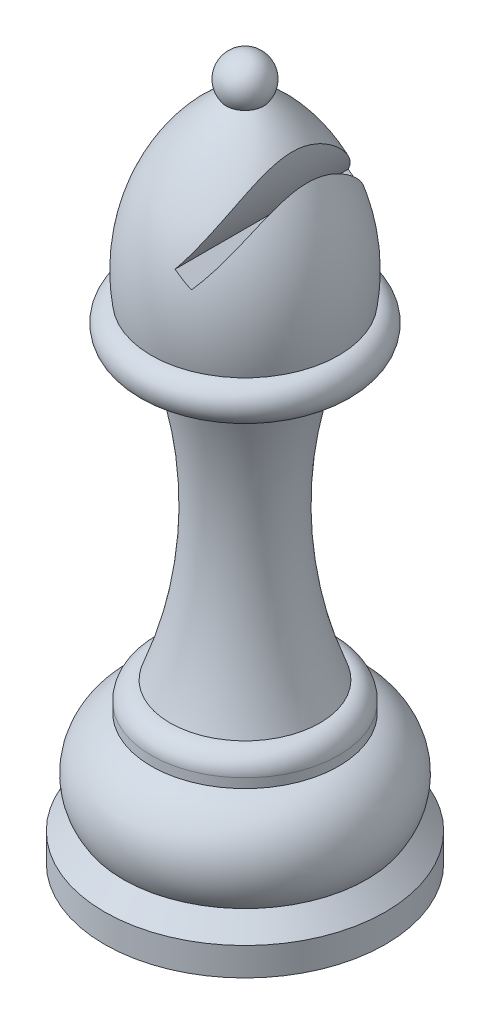
ISO-10303-21;
HEADER;
FILE_DESCRIPTION(('STEP AP214'),'2;1');
FILE_NAME('part.step','',(''),(''),'','','');
FILE_SCHEMA(('AUTOMOTIVE_DESIGN { 1 0 10303 214 1 1 1 1 }'));
ENDSEC;
DATA;
#1=APPLICATION_CONTEXT('core data for automotive mechanical design processes');
#2=APPLICATION_PROTOCOL_DEFINITION('international standard','automotive_design',2000,#1);
#3=PRODUCT_CONTEXT('',#1,'mechanical');
#4=PRODUCT('Part','Part','',(#3));
#5=PRODUCT_RELATED_PRODUCT_CATEGORY('part','',(#4));
#6=PRODUCT_DEFINITION_FORMATION('','',#4);
#7=PRODUCT_DEFINITION_CONTEXT('part definition',#1,'design');
#8=PRODUCT_DEFINITION('design','',#6,#7);
#9=PRODUCT_DEFINITION_SHAPE('','',#8);
#10=(LENGTH_UNIT() NAMED_UNIT(*) SI_UNIT(.MILLI.,.METRE.));
#11=(NAMED_UNIT(*) PLANE_ANGLE_UNIT() SI_UNIT($,.RADIAN.));
#12=(NAMED_UNIT(*) SI_UNIT($,.STERADIAN.) SOLID_ANGLE_UNIT());
#13=UNCERTAINTY_MEASURE_WITH_UNIT(LENGTH_MEASURE(1.E-05),#10,'distance_accuracy_value','');
#14=(GEOMETRIC_REPRESENTATION_CONTEXT(3) GLOBAL_UNCERTAINTY_ASSIGNED_CONTEXT((#13)) GLOBAL_UNIT_ASSIGNED_CONTEXT((#10,
#11,#12)) REPRESENTATION_CONTEXT('',''));
#15=CARTESIAN_POINT('',(0.,0.,0.));
#16=DIRECTION('',(0.,0.,1.));
#17=DIRECTION('',(1.,0.,0.));
#18=AXIS2_PLACEMENT_3D('',#15,#16,#17);
#19=CARTESIAN_POINT('',(0.,-57.54,0.));
#20=DIRECTION('',(0.,1.,0.));
#21=DIRECTION('',(0.,0.,1.));
#22=AXIS2_PLACEMENT_3D('',#19,#20,#21);
#23=TOROIDAL_SURFACE('',#22,7.99999999999999,2.);
#24=CARTESIAN_POINT('',(0.,-57.54,0.));
#25=DIRECTION('',(0.,1.,0.));
#26=DIRECTION('',(0.,0.,1.));
#27=AXIS2_PLACEMENT_3D('',#24,#25,#26);
#28=CIRCLE('',#27,9.99999999999999);
#29=CARTESIAN_POINT('',(0.,-57.54,9.99999999999999));
#30=VERTEX_POINT('',#29);
#31=EDGE_CURVE('E106',#30,#30,#28,.T.);
#32=ORIENTED_EDGE('',*,*,#31,.T.);
#33=EDGE_LOOP('',(#32));
#34=FACE_BOUND('',#33,.T.);
#35=CARTESIAN_POINT('',(0.,-55.54,0.));
#36=DIRECTION('',(0.,1.,0.));
#37=DIRECTION('',(0.,0.,1.));
#38=AXIS2_PLACEMENT_3D('',#35,#36,#37);
#39=CIRCLE('',#38,7.99999999999999);
#40=CARTESIAN_POINT('',(0.,-55.54,7.99999999999999));
#41=VERTEX_POINT('',#40);
#42=EDGE_CURVE('E74',#41,#41,#39,.T.);
#43=ORIENTED_EDGE('',*,*,#42,.F.);
#44=EDGE_LOOP('',(#43));
#45=FACE_BOUND('',#44,.T.);
#46=ADVANCED_FACE('F34',(#34,#45),#23,.T.);
#47=CARTESIAN_POINT('',(0.,9.94220309819706,0.));
#48=DIRECTION('',(0.,1.,0.));
#49=DIRECTION('',(0.,0.,1.));
#50=AXIS2_PLACEMENT_3D('',#47,#48,#49);
#51=CYLINDRICAL_SURFACE('',#50,9.99999999999999);
#52=CARTESIAN_POINT('',(0.,-58.54,0.));
#53=DIRECTION('',(0.,1.,0.));
#54=DIRECTION('',(0.,0.,1.));
#55=AXIS2_PLACEMENT_3D('',#52,#53,#54);
#56=CIRCLE('',#55,9.99999999999999);
#57=CARTESIAN_POINT('',(0.,-58.54,9.99999999999999));
#58=VERTEX_POINT('',#57);
#59=EDGE_CURVE('E103',#58,#58,#56,.T.);
#60=ORIENTED_EDGE('',*,*,#59,.T.);
#61=EDGE_LOOP('',(#60));
#62=FACE_BOUND('',#61,.T.);
#63=ORIENTED_EDGE('',*,*,#31,.F.);
#64=EDGE_LOOP('',(#63));
#65=FACE_BOUND('',#64,.T.);
#66=ADVANCED_FACE('F157',(#62,#65),#51,.T.);
#67=CARTESIAN_POINT('',(0.,-64.1961933857143,0.));
#68=DIRECTION('',(0.,1.,0.));
#69=DIRECTION('',(0.,0.,1.));
#70=AXIS2_PLACEMENT_3D('',#67,#68,#69);
#71=TOROIDAL_SURFACE('',#70,7.99813177671416,6.);
#72=CARTESIAN_POINT('',(0.,-67.51,0.));
#73=DIRECTION('',(0.,1.,0.));
#74=DIRECTION('',(0.,0.,1.));
#75=AXIS2_PLACEMENT_3D('',#72,#73,#74);
#76=CIRCLE('',#75,13.);
#77=CARTESIAN_POINT('',(0.,-67.51,13.));
#78=VERTEX_POINT('',#77);
#79=EDGE_CURVE('E100',#78,#78,#76,.T.);
#80=ORIENTED_EDGE('',*,*,#79,.T.);
#81=EDGE_LOOP('',(#80));
#82=FACE_BOUND('',#81,.T.);
#83=ORIENTED_EDGE('',*,*,#59,.F.);
#84=EDGE_LOOP('',(#83));
#85=FACE_BOUND('',#84,.T.);
#86=ADVANCED_FACE('F162',(#82,#85),#71,.T.);
#87=CARTESIAN_POINT('',(0.,-67.51,0.));
#88=DIRECTION('',(0.,-1.,0.));
#89=DIRECTION('',(0.,0.,-1.));
#90=AXIS2_PLACEMENT_3D('',#87,#88,#89);
#91=CONICAL_SURFACE('',#90,13.,0.785398163397453);
#92=CARTESIAN_POINT('',(0.,-69.51,0.));
#93=DIRECTION('',(0.,1.,0.));
#94=DIRECTION('',(0.,0.,1.));
#95=AXIS2_PLACEMENT_3D('',#92,#93,#94);
#96=CIRCLE('',#95,15.);
#97=CARTESIAN_POINT('',(0.,-69.51,15.));
#98=VERTEX_POINT('',#97);
#99=EDGE_CURVE('E92',#98,#98,#96,.T.);
#100=ORIENTED_EDGE('',*,*,#99,.T.);
#101=EDGE_LOOP('',(#100));
#102=FACE_BOUND('',#101,.T.);
#103=ORIENTED_EDGE('',*,*,#79,.F.);
#104=EDGE_LOOP('',(#103));
#105=FACE_BOUND('',#104,.T.);
#106=ADVANCED_FACE('F173',(#102,#105),#91,.T.);
#107=CARTESIAN_POINT('',(0.,9.94220309819706,0.));
#108=DIRECTION('',(0.,1.,0.));
#109=DIRECTION('',(0.,0.,1.));
#110=AXIS2_PLACEMENT_3D('',#107,#108,#109);
#111=CYLINDRICAL_SURFACE('',#110,15.);
#112=CARTESIAN_POINT('',(0.,-72.51,0.));
#113=DIRECTION('',(0.,1.,0.));
#114=DIRECTION('',(0.,0.,1.));
#115=AXIS2_PLACEMENT_3D('',#112,#113,#114);
#116=CIRCLE('',#115,15.);
#117=CARTESIAN_POINT('',(0.,-72.51,15.));
#118=VERTEX_POINT('',#117);
#119=EDGE_CURVE('E89',#118,#118,#116,.T.);
#120=ORIENTED_EDGE('',*,*,#119,.T.);
#121=EDGE_LOOP('',(#120));
#122=FACE_BOUND('',#121,.T.);
#123=ORIENTED_EDGE('',*,*,#99,.F.);
#124=EDGE_LOOP('',(#123));
#125=FACE_BOUND('',#124,.T.);
#126=ADVANCED_FACE('F179',(#122,#125),#111,.T.);
#127=CARTESIAN_POINT('',(-15.,-72.51,0.));
#128=DIRECTION('',(0.,-1.,0.));
#129=DIRECTION('',(0.,0.,-1.));
#130=AXIS2_PLACEMENT_3D('',#127,#128,#129);
#131=PLANE('',#130);
#132=ORIENTED_EDGE('',*,*,#119,.F.);
#133=EDGE_LOOP('',(#132));
#134=FACE_BOUND('',#133,.T.);
#135=ADVANCED_FACE('F183',(#134),#131,.T.);
#136=CARTESIAN_POINT('',(0.,0.,0.));
#137=DIRECTION('',(0.,1.,0.));
#138=DIRECTION('',(1.,0.,0.));
#139=AXIS2_PLACEMENT_3D('',#136,#137,#138);
#140=SPHERICAL_SURFACE('',#139,2.5);
#141=CARTESIAN_POINT('',(0.,-1.5,0.));
#142=DIRECTION('',(0.,1.,0.));
#143=DIRECTION('',(0.,0.,1.));
#144=AXIS2_PLACEMENT_3D('',#141,#142,#143);
#145=CIRCLE('',#144,2.);
#146=CARTESIAN_POINT('',(0.,-1.5,2.));
#147=VERTEX_POINT('',#146);
#148=EDGE_CURVE('E87',#147,#147,#145,.T.);
#149=ORIENTED_EDGE('',*,*,#148,.T.);
#150=EDGE_LOOP('',(#149));
#151=FACE_BOUND('',#150,.T.);
#152=ADVANCED_FACE('F80',(#151),#140,.T.);
#153=CARTESIAN_POINT('',(0.,-17.6567163069648,0.));
#154=DIRECTION('',(0.,1.,0.));
#155=DIRECTION('',(0.,0.,1.));
#156=AXIS2_PLACEMENT_3D('',#153,#154,#155);
#157=DEGENERATE_TOROIDAL_SURFACE('',#156,9.78815160134356,20.,.F.);
#158=CARTESIAN_POINT('',(3.39324244572902,-13.248729612367,-9.10852018608392));
#159=CARTESIAN_POINT('',(3.2595717966119,-13.1513035375879,-9.13482636648575));
#160=CARTESIAN_POINT('',(3.12542693965622,-13.0535318356374,-9.15742841355983));
#161=CARTESIAN_POINT('',(2.85672002664111,-12.8576843554764,-9.19519504568503));
#162=CARTESIAN_POINT('',(2.72215929474827,-12.7596095423868,-9.21037405208227));
#163=CARTESIAN_POINT('',(2.45262560632293,-12.5631594655938,-9.23336817218856));
#164=CARTESIAN_POINT('',(2.31765264166154,-12.4647841959657,-9.24118313973178));
#165=CARTESIAN_POINT('',(2.04729543465764,-12.267733896288,-9.24947444345053));
#166=CARTESIAN_POINT('',(1.91191090407078,-12.1690586561511,-9.24993640694499));
#167=CARTESIAN_POINT('',(1.77658429981895,-12.0704256357197,-9.24671953048214));
#168=B_SPLINE_CURVE_WITH_KNOTS('',3,(#158,#159,#160,#161,#162,#163,#164,#165,#166,#167),
.UNSPECIFIED.,.F.,.F.,(4,2,2,2,4),(0.,0.502414031168213,1.00384806515695,1.50529205169696,
2.00771607460314),.UNSPECIFIED.);
#169=CARTESIAN_POINT('',(3.39304244572901,-13.2485838420346,-9.10855954127141));
#170=VERTEX_POINT('',#169);
#171=CARTESIAN_POINT('',(1.77678429981895,-12.0705714060521,-9.24672428054398));
#172=VERTEX_POINT('',#171);
#173=EDGE_CURVE('E11',#170,#172,#168,.T.);
#174=ORIENTED_EDGE('',*,*,#173,.F.);
#175=CARTESIAN_POINT('',(3.39287762474508,-13.2487838420346,9.10866916223183));
#176=CARTESIAN_POINT('',(3.59065928543186,-13.0088528453584,8.97711955453691));
#177=CARTESIAN_POINT('',(3.77821557079788,-12.7664321154023,8.83506159507021));
#178=CARTESIAN_POINT('',(4.13309084565667,-12.2793995862603,8.53126278346262));
#179=CARTESIAN_POINT('',(4.30042284128863,-12.0347893050636,8.36953471679838));
#180=CARTESIAN_POINT('',(4.61583553214681,-11.5450452614372,8.02699402593315));
#181=CARTESIAN_POINT('',(4.76385112573451,-11.2999124219678,7.84612040514663));
#182=CARTESIAN_POINT('',(5.0406598808591,-10.81254584413,7.46656284991351));
#183=CARTESIAN_POINT('',(5.16944983637574,-10.5703125954712,7.26787595379106));
#184=CARTESIAN_POINT('',(5.41330190571806,-10.0821264437611,6.84509889902637));
#185=CARTESIAN_POINT('',(5.52762319377013,-9.83640303268625,6.62031627708898));
#186=CARTESIAN_POINT('',(5.73742180468711,-9.35453553032749,6.1523113082327));
#187=CARTESIAN_POINT('',(5.83289535978563,-9.11839336186774,5.90908528779958));
#188=CARTESIAN_POINT('',(6.00600711677011,-8.66017088752531,5.40443206642151));
#189=CARTESIAN_POINT('',(6.08367130929929,-8.43807043698877,5.14303212415213));
#190=CARTESIAN_POINT('',(6.2225388930289,-8.01275269376267,4.60126052951307));
#191=CARTESIAN_POINT('',(6.28375283169019,-7.80952335639987,4.32090117845341));
#192=CARTESIAN_POINT('',(6.36848576051102,-7.50869763585441,3.86241639708243));
#193=CARTESIAN_POINT('',(6.39704130959248,-7.40257169472129,3.69078072049819));
#194=CARTESIAN_POINT('',(6.4492976182802,-7.20062591601889,3.34077039440289));
#195=CARTESIAN_POINT('',(6.47299803963671,-7.10480679673173,3.16239527638936));
#196=CARTESIAN_POINT('',(6.51572898105162,-6.92560945338317,2.79932457436113));
#197=CARTESIAN_POINT('',(6.53476769472171,-6.8422095034886,2.61464073964285));
#198=CARTESIAN_POINT('',(6.56843503629945,-6.68988111318258,2.2390230613816));
#199=CARTESIAN_POINT('',(6.58306527209652,-6.62094739934054,2.0480915247777));
#200=CARTESIAN_POINT('',(6.6060185853435,-6.50993497884289,1.69293802801173));
#201=CARTESIAN_POINT('',(6.61498610671272,-6.46529622351715,1.52955902739174));
#202=CARTESIAN_POINT('',(6.630068075759,-6.38896801664939,1.1997283273432));
#203=CARTESIAN_POINT('',(6.63618392353707,-6.35727221139155,1.03327817759301));
#204=CARTESIAN_POINT('',(6.64562496656999,-6.307872655926,0.69835246569176));
#205=CARTESIAN_POINT('',(6.64895235309748,-6.29015791953277,0.529878599661379));
#206=CARTESIAN_POINT('',(6.65285854624023,-6.269325826847,0.19198944902191));
#207=CARTESIAN_POINT('',(6.65343734637262,-6.26620850498426,0.0225741621933085));
#208=CARTESIAN_POINT('',(6.65185166821324,-6.27469377614706,-0.315995635086534));
#209=CARTESIAN_POINT('',(6.6496851731339,-6.28630719088085,-0.48514986231406));
#210=CARTESIAN_POINT('',(6.64258330008858,-6.3238360941999,-0.821790243561001));
#211=CARTESIAN_POINT('',(6.63764790765,-6.34975165754031,-0.989276388856947));
#212=CARTESIAN_POINT('',(6.62495240875765,-6.41501578536894,-1.32164894466047));
#213=CARTESIAN_POINT('',(6.61718958462753,-6.4543772715669,-1.48653269417007));
#214=CARTESIAN_POINT('',(6.59876136812688,-6.54533998067559,-1.81279016712529));
#215=CARTESIAN_POINT('',(6.58809427179658,-6.59694838666272,-1.97416176975302));
#216=CARTESIAN_POINT('',(6.55867086505095,-6.73493271193583,-2.35941027467546));
#217=CARTESIAN_POINT('',(6.53839724279052,-6.82682238804541,-2.58120304062644));
#218=CARTESIAN_POINT('',(6.49149433356611,-7.02871220319607,-3.01558048397352));
#219=CARTESIAN_POINT('',(6.46486446222178,-7.13871400714002,-3.22816431259459));
#220=CARTESIAN_POINT('',(6.40478416860406,-7.37383811521088,-3.64458872137908));
#221=CARTESIAN_POINT('',(6.3713136201585,-7.49900458280458,-3.848401302605));
#222=CARTESIAN_POINT('',(6.29720889637722,-7.76137406348501,-4.24669199032426));
#223=CARTESIAN_POINT('',(6.25657480598565,-7.8985769338363,-4.44117020746823));
#224=CARTESIAN_POINT('',(6.14648820069791,-8.25064921889427,-4.91185544352306));
#225=CARTESIAN_POINT('',(6.07254351673479,-8.47130099334055,-5.18270615772814));
#226=CARTESIAN_POINT('',(5.90677777706816,-8.9280969096506,-5.70527345736642));
#227=CARTESIAN_POINT('',(5.81494846381267,-9.16424817429789,-5.95698112928992));
#228=CARTESIAN_POINT('',(5.61227848103953,-9.6472797537831,-6.44126344484155));
#229=CARTESIAN_POINT('',(5.50145429272416,-9.89415063008096,-6.67385441867144));
#230=CARTESIAN_POINT('',(5.25962960520234,-10.3950209361088,-7.11996328535031));
#231=CARTESIAN_POINT('',(5.12863508221723,-10.6490182361973,-7.3334867981423));
#232=CARTESIAN_POINT('',(4.87942778683282,-11.0995109334168,-7.69210680535139));
#233=CARTESIAN_POINT('',(4.7656744901184,-11.2951999198998,-7.84133918144583));
#234=CARTESIAN_POINT('',(4.52559764358338,-11.6874108438505,-8.12806138758332));
#235=CARTESIAN_POINT('',(4.39927695844201,-11.8839325817623,-8.26555388046172));
#236=CARTESIAN_POINT('',(4.13388603513372,-12.2763176527467,-8.52818873513225));
#237=CARTESIAN_POINT('',(3.99482694248693,-12.4721814088524,-8.653341698058));
#238=CARTESIAN_POINT('',(3.70366159518798,-12.8621607910959,-8.89081993765263));
#239=CARTESIAN_POINT('',(3.55154869076117,-13.0562754699283,-9.00313860763272));
#240=CARTESIAN_POINT('',(3.39287762474508,-13.2487838420346,-9.10866916223183));
#241=B_SPLINE_CURVE_WITH_KNOTS('',3,(#175,#176,#177,#178,#179,#180,#181,#182,#183,#184,#185,
#186,#187,#188,#189,#190,#191,#192,#193,#194,#195,#196,#197,#198,#199,#200,#201,#202,#203,#204,
#205,#206,#207,#208,#209,#210,#211,#212,#213,#214,#215,#216,#217,#218,#219,#220,#221,#222,#223,
#224,#225,#226,#227,#228,#229,#230,#231,#232,#233,#234,#235,#236,#237,#238,#239,#240),
.UNSPECIFIED.,.F.,.F.,(4,2,2,2,2,2,2,2,2,2,2,2,2,2,2,2,2,2,2,2,2,2,2,2,2,2,2,2,2,2,2,2,4),(0.,
1.01236238775747,2.02407022658224,3.03910427971063,4.05430740879688,5.10951041006697,
6.1649241391425,7.21878767361562,8.27197387813874,8.88303842014661,9.49414551967276,
10.1041706748076,10.7139730674466,11.222292135026,11.7303613670735,12.2380309647461,
12.7457017598193,13.2537457235004,13.7617923426754,14.2703285813639,14.779163827692,
15.5008036143081,16.2225097725616,16.9463706685132,17.6702229816142,18.7399899164224,
19.8102519516775,20.8795900152446,21.9486118546313,22.761456961807,23.5741172073068,
24.3860730829266,25.1984450625799),.UNSPECIFIED.);
#242=CARTESIAN_POINT('',(3.39304244572901,-13.2485838420346,9.10855954127142));
#243=VERTEX_POINT('',#242);
#244=EDGE_CURVE('E67',#243,#170,#241,.T.);
#245=ORIENTED_EDGE('',*,*,#244,.F.);
#246=CARTESIAN_POINT('',(1.77658429981895,-12.0704256357197,9.24671953048214));
#247=CARTESIAN_POINT('',(1.91191090407078,-12.1690586561511,9.24993640694499));
#248=CARTESIAN_POINT('',(2.04729543465764,-12.267733896288,9.24947444345053));
#249=CARTESIAN_POINT('',(2.31765264166154,-12.4647841959657,9.24118313973178));
#250=CARTESIAN_POINT('',(2.45262560632293,-12.5631594655938,9.23336817218856));
#251=CARTESIAN_POINT('',(2.72215929474827,-12.7596095423868,9.21037405208227));
#252=CARTESIAN_POINT('',(2.85672002664111,-12.8576843554764,9.19519504568502));
#253=CARTESIAN_POINT('',(3.12542693965622,-13.0535318356374,9.15742841355982));
#254=CARTESIAN_POINT('',(3.2595717966119,-13.1513035375879,9.13482636648575));
#255=CARTESIAN_POINT('',(3.39324244572902,-13.248729612367,9.10852018608393));
#256=B_SPLINE_CURVE_WITH_KNOTS('',3,(#246,#247,#248,#249,#250,#251,#252,#253,#254,#255),
.UNSPECIFIED.,.F.,.F.,(4,2,2,2,4),(0.,0.502424022906182,1.00386800944619,1.50530204343493,
2.00771607460314),.UNSPECIFIED.);
#257=CARTESIAN_POINT('',(1.77678429980671,-12.0705714060432,9.24672428054368));
#258=VERTEX_POINT('',#257);
#259=EDGE_CURVE('E71',#258,#243,#256,.T.);
#260=ORIENTED_EDGE('',*,*,#259,.F.);
#261=CARTESIAN_POINT('',(1.77663821694885,-12.0707714060521,-9.24681158931695));
#262=CARTESIAN_POINT('',(1.94996293468443,-11.833524826258,-9.14322438018559));
#263=CARTESIAN_POINT('',(2.11538564419684,-11.5948096121683,-9.03005475968842));
#264=CARTESIAN_POINT('',(2.430494480658,-11.1164206369497,-8.78575935569903));
#265=CARTESIAN_POINT('',(2.58019042829098,-10.8767475722055,-8.65464489721432));
#266=CARTESIAN_POINT('',(2.86413583291477,-10.3981099867038,-8.37553025540672));
#267=CARTESIAN_POINT('',(2.99838471178571,-10.159145492791,-8.22752944050997));
#268=CARTESIAN_POINT('',(3.25186986234965,-9.68365033107076,-7.91553689070444));
#269=CARTESIAN_POINT('',(3.37110303910312,-9.44712017420845,-7.75154187149315));
#270=CARTESIAN_POINT('',(3.61052815238971,-8.94592811008317,-7.38463010761515));
#271=CARTESIAN_POINT('',(3.72858225551766,-8.68188788024893,-7.1794651799679));
#272=CARTESIAN_POINT('',(3.94688663608768,-8.16194084624557,-6.75014977330699));
#273=CARTESIAN_POINT('',(4.04713373175022,-7.90603550232207,-6.52599591187213));
#274=CARTESIAN_POINT('',(4.23090525446296,-7.40533437587352,-6.05906523088914));
#275=CARTESIAN_POINT('',(4.31442586012685,-7.16054114191216,-5.81628417319634));
#276=CARTESIAN_POINT('',(4.46584531271795,-6.68575896092766,-5.31216583606849));
#277=CARTESIAN_POINT('',(4.53375044642866,-6.45576408304541,-5.05083607998233));
#278=CARTESIAN_POINT('',(4.63325227990736,-6.09468479246646,-4.60678426261359));
#279=CARTESIAN_POINT('',(4.66911367323122,-5.95783085601504,-4.42968251672394));
#280=CARTESIAN_POINT('',(4.73524709760273,-5.69370317559492,-4.06743736637734));
#281=CARTESIAN_POINT('',(4.76551922486142,-5.56642926674236,-3.8822941004112));
#282=CARTESIAN_POINT('',(4.82072753104389,-5.32364375031338,-3.50393624482538));
#283=CARTESIAN_POINT('',(4.84567004519212,-5.20811826419326,-3.31073156805447));
#284=CARTESIAN_POINT('',(4.89051522377647,-4.99130885930159,-2.91602437621111));
#285=CARTESIAN_POINT('',(4.91041930140007,-4.89002095070755,-2.71452420634593));
#286=CARTESIAN_POINT('',(4.95399357099527,-4.65953626024873,-2.20234748643544));
#287=CARTESIAN_POINT('',(4.97475459522544,-4.54087274814245,-1.8864180149822));
#288=CARTESIAN_POINT('',(4.99825259851645,-4.40158244519661,-1.40153546629498));
#289=CARTESIAN_POINT('',(5.00480923432166,-4.36161904957867,-1.23820622903867));
#290=CARTESIAN_POINT('',(5.01542976578263,-4.29598358508892,-0.908568198525533));
#291=CARTESIAN_POINT('',(5.01949378469586,-4.27031080956577,-0.74225955301615));
#292=CARTESIAN_POINT('',(5.02516913965536,-4.2342551253358,-0.40647754774319));
#293=CARTESIAN_POINT('',(5.02675892206138,-4.22400660599667,-0.236989253001299));
#294=CARTESIAN_POINT('',(5.02742492468971,-4.21972760812744,0.102195248171838));
#295=CARTESIAN_POINT('',(5.02650122595022,-4.22569660672146,0.271891447723614));
#296=CARTESIAN_POINT('',(5.02213419839543,-4.25357067307198,0.610118045262691));
#297=CARTESIAN_POINT('',(5.01868796791366,-4.27549409301983,0.778646874869889));
#298=CARTESIAN_POINT('',(5.00925773051182,-4.33427433996745,1.11299805486751));
#299=CARTESIAN_POINT('',(5.0032732855778,-4.37113374438736,1.27881993299396));
#300=CARTESIAN_POINT('',(4.98721690754102,-4.46741030366609,1.64099357572484));
#301=CARTESIAN_POINT('',(4.97655246198166,-4.52993032192481,1.8364917554473));
#302=CARTESIAN_POINT('',(4.95137418552101,-4.67171659951812,2.22108204898427));
#303=CARTESIAN_POINT('',(4.93685833746763,-4.75099162976466,2.41017074716971));
#304=CARTESIAN_POINT('',(4.90380388129065,-4.92370171071678,2.78191990028059));
#305=CARTESIAN_POINT('',(4.8852554347408,-5.01717122085468,2.96456334103441));
#306=CARTESIAN_POINT('',(4.84398833047728,-5.21573520044447,3.32287487298799));
#307=CARTESIAN_POINT('',(4.82126950844207,-5.3208301278973,3.49854268900167));
#308=CARTESIAN_POINT('',(4.75602972949207,-5.60878762852462,3.9497814127553));
#309=CARTESIAN_POINT('',(4.70995886524637,-5.79950345266348,4.21984589554005));
#310=CARTESIAN_POINT('',(4.60541196142417,-6.20005867885052,4.74289296439304));
#311=CARTESIAN_POINT('',(4.54692864773727,-6.40990925319082,4.99586541885515));
#312=CARTESIAN_POINT('',(4.41651129361982,-6.84453441921315,5.48546939998595));
#313=CARTESIAN_POINT('',(4.34456162793501,-7.06932614999899,5.72208150222017));
#314=CARTESIAN_POINT('',(4.18629948034157,-7.53020333852773,6.17878067152042));
#315=CARTESIAN_POINT('',(4.09999023233402,-7.76628624489043,6.39887144317259));
#316=CARTESIAN_POINT('',(3.90744915821106,-8.25887513459227,6.83283480077504));
#317=CARTESIAN_POINT('',(3.80044847459859,-8.51581504209223,7.04587454928128));
#318=CARTESIAN_POINT('',(3.56856783578555,-9.03653014894064,7.45318593468274));
#319=CARTESIAN_POINT('',(3.44368404769303,-9.30030680365977,7.64745353314867));
#320=CARTESIAN_POINT('',(3.17557148193187,-9.83135442794264,8.01575829921787));
#321=CARTESIAN_POINT('',(3.03239498429889,-10.0986135623875,8.18985052360655));
#322=CARTESIAN_POINT('',(2.72682296156636,-10.6347499372077,8.51715729175281));
#323=CARTESIAN_POINT('',(2.56443893314633,-10.9036261191282,8.67038420747241));
#324=CARTESIAN_POINT('',(2.29580870718178,-11.322430031164,8.89204849663565));
#325=CARTESIAN_POINT('',(2.19627930789922,-11.4726679134158,8.9681401322171));
#326=CARTESIAN_POINT('',(1.99107844367065,-11.7723836310606,9.1130165148652));
#327=CARTESIAN_POINT('',(1.88540901249548,-11.9218617004875,9.18180366030168));
#328=CARTESIAN_POINT('',(1.77663821694885,-12.0707714060521,9.24681158931695));
#329=B_SPLINE_CURVE_WITH_KNOTS('',3,(#261,#262,#263,#264,#265,#266,#267,#268,#269,#270,#271,
#272,#273,#274,#275,#276,#277,#278,#279,#280,#281,#282,#283,#284,#285,#286,#287,#288,#289,#290,
#291,#292,#293,#294,#295,#296,#297,#298,#299,#300,#301,#302,#303,#304,#305,#306,#307,#308,#309,
#310,#311,#312,#313,#314,#315,#316,#317,#318,#319,#320,#321,#322,#323,#324,#325,#326,#327,#328),
.UNSPECIFIED.,.F.,.F.,(4,2,2,2,2,2,2,2,2,2,2,2,2,2,2,2,2,2,2,2,2,2,2,2,2,2,2,2,2,2,2,2,2,4),(0.,
0.934239246499522,1.86789158918282,2.80157886325218,3.73545826903542,4.79819741252422,
5.86112625704485,6.92429766528398,7.98704028877699,8.66670379299874,9.34635559671469,
10.0251949588548,10.7038437077186,11.7139760023118,12.2182679960313,12.7225350509951,
13.2311707820784,13.7397901142162,14.2489954320824,14.7582886581363,15.3739067305657,
15.9898478684199,16.607308941788,17.2247943496403,18.2246994619716,19.2251921781676,
20.2268530633031,21.2282886704178,22.2787841123258,23.3295050452195,24.3772875471107,
25.4244460418132,26.0110975517555,26.5975558399505),.UNSPECIFIED.);
#330=EDGE_CURVE('E47',#172,#258,#329,.T.);
#331=ORIENTED_EDGE('',*,*,#330,.F.);
#332=EDGE_LOOP('',(#174,#245,#260,#331));
#333=FACE_BOUND('',#332,.T.);
#334=CARTESIAN_POINT('',(0.,-20.56,0.));
#335=DIRECTION('',(0.,1.,0.));
#336=DIRECTION('',(0.,0.,1.));
#337=AXIS2_PLACEMENT_3D('',#334,#335,#336);
#338=CIRCLE('',#337,9.99999999999999);
#339=CARTESIAN_POINT('',(0.,-20.56,9.99999999999999));
#340=VERTEX_POINT('',#339);
#341=EDGE_CURVE('E84',#340,#340,#338,.T.);
#342=ORIENTED_EDGE('',*,*,#341,.T.);
#343=EDGE_LOOP('',(#342));
#344=FACE_BOUND('',#343,.T.);
#345=ORIENTED_EDGE('',*,*,#148,.F.);
#346=EDGE_LOOP('',(#345));
#347=FACE_BOUND('',#346,.T.);
#348=ADVANCED_FACE('F76',(#333,#344,#347),#157,.F.);
#349=CARTESIAN_POINT('',(0.,-22.54,0.));
#350=DIRECTION('',(0.,1.,0.));
#351=DIRECTION('',(0.,0.,1.));
#352=AXIS2_PLACEMENT_3D('',#349,#350,#351);
#353=TOROIDAL_SURFACE('',#352,9.71786528040668,2.);
#354=CARTESIAN_POINT('',(0.,-24.52,0.));
#355=DIRECTION('',(0.,1.,0.));
#356=DIRECTION('',(0.,0.,1.));
#357=AXIS2_PLACEMENT_3D('',#354,#355,#356);
#358=CIRCLE('',#357,10.);
#359=CARTESIAN_POINT('',(0.,-24.52,10.));
#360=VERTEX_POINT('',#359);
#361=EDGE_CURVE('E94',#360,#360,#358,.T.);
#362=ORIENTED_EDGE('',*,*,#361,.T.);
#363=EDGE_LOOP('',(#362));
#364=FACE_BOUND('',#363,.T.);
#365=ORIENTED_EDGE('',*,*,#341,.F.);
#366=EDGE_LOOP('',(#365));
#367=FACE_BOUND('',#366,.T.);
#368=ADVANCED_FACE('F79',(#364,#367),#353,.T.);
#369=CARTESIAN_POINT('',(-10.,-24.52,0.));
#370=DIRECTION('',(0.,-1.,0.));
#371=DIRECTION('',(0.,0.,-1.));
#372=AXIS2_PLACEMENT_3D('',#369,#370,#371);
#373=PLANE('',#372);
#374=CARTESIAN_POINT('',(0.,-24.52,0.));
#375=DIRECTION('',(0.,1.,0.));
#376=DIRECTION('',(0.,0.,1.));
#377=AXIS2_PLACEMENT_3D('',#374,#375,#376);
#378=CIRCLE('',#377,7.49999999999999);
#379=CARTESIAN_POINT('',(0.,-24.52,7.49999999999999));
#380=VERTEX_POINT('',#379);
#381=EDGE_CURVE('E141',#380,#380,#378,.T.);
#382=ORIENTED_EDGE('',*,*,#381,.T.);
#383=EDGE_LOOP('',(#382));
#384=FACE_BOUND('',#383,.T.);
#385=ORIENTED_EDGE('',*,*,#361,.F.);
#386=EDGE_LOOP('',(#385));
#387=FACE_BOUND('',#386,.T.);
#388=ADVANCED_FACE('F148',(#384,#387),#373,.T.);
#389=CARTESIAN_POINT('',(0.,-39.3492068800987,0.));
#390=DIRECTION('',(0.,1.,0.));
#391=DIRECTION('',(0.,0.,1.));
#392=AXIS2_PLACEMENT_3D('',#389,#390,#391);
#393=TOROIDAL_SURFACE('',#392,49.9864051586767,45.);
#394=ORIENTED_EDGE('',*,*,#42,.T.);
#395=EDGE_LOOP('',(#394));
#396=FACE_BOUND('',#395,.T.);
#397=ORIENTED_EDGE('',*,*,#381,.F.);
#398=EDGE_LOOP('',(#397));
#399=FACE_BOUND('',#398,.T.);
#400=ADVANCED_FACE('F130',(#396,#399),#393,.F.);
#401=CARTESIAN_POINT('',(-12.7587858628802,-1.45373571714504,-15.));
#402=DIRECTION('',(0.,0.,1.));
#403=DIRECTION('',(1.,0.,0.));
#404=AXIS2_PLACEMENT_3D('',#401,#402,#403);
#405=CYLINDRICAL_SURFACE('',#404,18.);
#406=DIRECTION('',(0.,0.,1.));
#407=VECTOR('',#406,1.);
#408=CARTESIAN_POINT('',(1.77678429981895,-12.0705714060521,-15.));
#409=LINE('',#408,#407);
#410=EDGE_CURVE('E53',#172,#258,#409,.T.);
#411=ORIENTED_EDGE('',*,*,#410,.F.);
#412=ORIENTED_EDGE('',*,*,#330,.T.);
#413=EDGE_LOOP('',(#411,#412));
#414=FACE_BOUND('',#413,.T.);
#415=ADVANCED_FACE('F125',(#414),#405,.T.);
#416=CARTESIAN_POINT('',(-8.51362788614616,-3.43640615938904,-15.));
#417=DIRECTION('',(0.,0.,1.));
#418=DIRECTION('',(1.,0.,0.));
#419=AXIS2_PLACEMENT_3D('',#416,#417,#418);
#420=CYLINDRICAL_SURFACE('',#419,15.4287922167538);
#421=ORIENTED_EDGE('',*,*,#244,.T.);
#422=DIRECTION('',(0.,0.,1.));
#423=VECTOR('',#422,1.);
#424=CARTESIAN_POINT('',(3.39304244572901,-13.2485838420346,-15.));
#425=LINE('',#424,#423);
#426=EDGE_CURVE('E70',#170,#243,#425,.T.);
#427=ORIENTED_EDGE('',*,*,#426,.T.);
#428=EDGE_LOOP('',(#421,#427));
#429=FACE_BOUND('',#428,.T.);
#430=ADVANCED_FACE('F69',(#429),#420,.F.);
#431=CARTESIAN_POINT('',(1.77678429981895,-12.0705714060521,-15.));
#432=DIRECTION('',(-0.589005946050939,-0.808128699847146,0.));
#433=DIRECTION('',(0.808128699847146,-0.589005946050939,0.));
#434=AXIS2_PLACEMENT_3D('',#431,#432,#433);
#435=PLANE('',#434);
#436=ORIENTED_EDGE('',*,*,#173,.T.);
#437=ORIENTED_EDGE('',*,*,#410,.T.);
#438=ORIENTED_EDGE('',*,*,#259,.T.);
#439=ORIENTED_EDGE('',*,*,#426,.F.);
#440=EDGE_LOOP('',(#436,#437,#438,#439));
#441=FACE_BOUND('',#440,.T.);
#442=ADVANCED_FACE('F73',(#441),#435,.F.);
#443=CLOSED_SHELL('',(#46,#66,#86,#106,#126,#135,#152,#348,#368,#388,#400,#415,#430,#442));
#444=MANIFOLD_SOLID_BREP('B2',#443);
#445=ADVANCED_BREP_SHAPE_REPRESENTATION('',(#18,#444),#14);
#446=SHAPE_DEFINITION_REPRESENTATION(#9,#445);
ENDSEC;
END-ISO-10303-21;
